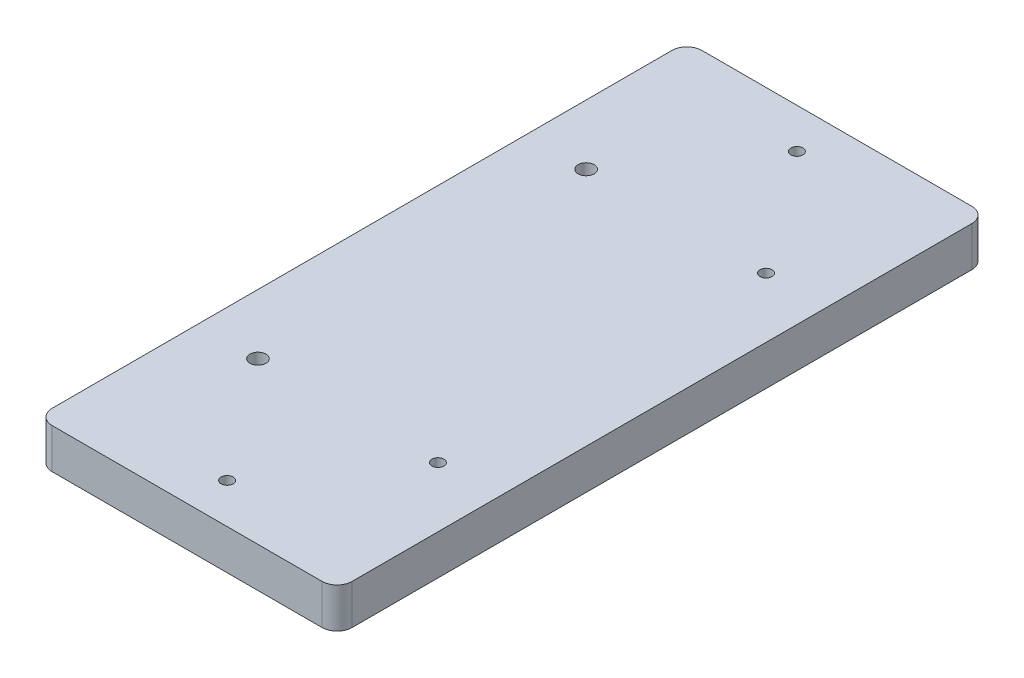
ISO-10303-21;
HEADER;
FILE_DESCRIPTION(('STEP AP214'),'2;1');
FILE_NAME('part.step','',(''),(''),'','','');
FILE_SCHEMA(('AUTOMOTIVE_DESIGN { 1 0 10303 214 1 1 1 1 }'));
ENDSEC;
DATA;
#1=APPLICATION_CONTEXT('core data for automotive mechanical design processes');
#2=APPLICATION_PROTOCOL_DEFINITION('international standard','automotive_design',2000,#1);
#3=PRODUCT_CONTEXT('',#1,'mechanical');
#4=PRODUCT('Part','Part','',(#3));
#5=PRODUCT_RELATED_PRODUCT_CATEGORY('part','',(#4));
#6=PRODUCT_DEFINITION_FORMATION('','',#4);
#7=PRODUCT_DEFINITION_CONTEXT('part definition',#1,'design');
#8=PRODUCT_DEFINITION('design','',#6,#7);
#9=PRODUCT_DEFINITION_SHAPE('','',#8);
#10=(LENGTH_UNIT() NAMED_UNIT(*) SI_UNIT(.MILLI.,.METRE.));
#11=(NAMED_UNIT(*) PLANE_ANGLE_UNIT() SI_UNIT($,.RADIAN.));
#12=(NAMED_UNIT(*) SI_UNIT($,.STERADIAN.) SOLID_ANGLE_UNIT());
#13=UNCERTAINTY_MEASURE_WITH_UNIT(LENGTH_MEASURE(1.E-05),#10,'distance_accuracy_value','');
#14=(GEOMETRIC_REPRESENTATION_CONTEXT(3) GLOBAL_UNCERTAINTY_ASSIGNED_CONTEXT((#13)) GLOBAL_UNIT_ASSIGNED_CONTEXT((#10,
#11,#12)) REPRESENTATION_CONTEXT('',''));
#15=CARTESIAN_POINT('',(0.,0.,0.));
#16=DIRECTION('',(0.,0.,1.));
#17=DIRECTION('',(1.,0.,0.));
#18=AXIS2_PLACEMENT_3D('',#15,#16,#17);
#19=CARTESIAN_POINT('',(0.,8.,0.));
#20=DIRECTION('',(0.,-1.,0.));
#21=DIRECTION('',(0.,0.,-1.));
#22=AXIS2_PLACEMENT_3D('',#19,#20,#21);
#23=PLANE('',#22);
#24=DIRECTION('',(-1.,0.,0.));
#25=VECTOR('',#24,1.);
#26=CARTESIAN_POINT('',(0.,8.,-130.));
#27=LINE('',#26,#25);
#28=CARTESIAN_POINT('',(57.,8.,-130.));
#29=VERTEX_POINT('',#28);
#30=CARTESIAN_POINT('',(3.,8.,-130.));
#31=VERTEX_POINT('',#30);
#32=EDGE_CURVE('E175',#29,#31,#27,.T.);
#33=ORIENTED_EDGE('',*,*,#32,.T.);
#34=CARTESIAN_POINT('',(3.,8.,-127.));
#35=DIRECTION('',(0.,-1.,0.));
#36=DIRECTION('',(0.,0.,-1.));
#37=AXIS2_PLACEMENT_3D('',#34,#35,#36);
#38=CIRCLE('',#37,3.);
#39=CARTESIAN_POINT('',(0.,8.,-127.));
#40=VERTEX_POINT('',#39);
#41=EDGE_CURVE('E152',#31,#40,#38,.F.);
#42=ORIENTED_EDGE('',*,*,#41,.T.);
#43=DIRECTION('',(0.,0.,1.));
#44=VECTOR('',#43,1.);
#45=CARTESIAN_POINT('',(0.,8.,0.));
#46=LINE('',#45,#44);
#47=CARTESIAN_POINT('',(0.,8.,-3.));
#48=VERTEX_POINT('',#47);
#49=EDGE_CURVE('E123',#40,#48,#46,.T.);
#50=ORIENTED_EDGE('',*,*,#49,.T.);
#51=CARTESIAN_POINT('',(3.,8.,-3.));
#52=DIRECTION('',(0.,-1.,0.));
#53=DIRECTION('',(0.,0.,-1.));
#54=AXIS2_PLACEMENT_3D('',#51,#52,#53);
#55=CIRCLE('',#54,3.);
#56=CARTESIAN_POINT('',(3.,8.,0.));
#57=VERTEX_POINT('',#56);
#58=EDGE_CURVE('E147',#48,#57,#55,.F.);
#59=ORIENTED_EDGE('',*,*,#58,.T.);
#60=DIRECTION('',(1.,0.,0.));
#61=VECTOR('',#60,1.);
#62=CARTESIAN_POINT('',(60.,8.,0.));
#63=LINE('',#62,#61);
#64=CARTESIAN_POINT('',(57.,8.,0.));
#65=VERTEX_POINT('',#64);
#66=EDGE_CURVE('E130',#57,#65,#63,.T.);
#67=ORIENTED_EDGE('',*,*,#66,.T.);
#68=CARTESIAN_POINT('',(57.,8.,-3.));
#69=DIRECTION('',(0.,-1.,0.));
#70=DIRECTION('',(0.,0.,-1.));
#71=AXIS2_PLACEMENT_3D('',#68,#69,#70);
#72=CIRCLE('',#71,3.);
#73=CARTESIAN_POINT('',(60.,8.,-3.));
#74=VERTEX_POINT('',#73);
#75=EDGE_CURVE('E59',#65,#74,#72,.F.);
#76=ORIENTED_EDGE('',*,*,#75,.T.);
#77=DIRECTION('',(0.,0.,-1.));
#78=VECTOR('',#77,1.);
#79=CARTESIAN_POINT('',(60.,8.,-130.));
#80=LINE('',#79,#78);
#81=CARTESIAN_POINT('',(60.,8.,-127.));
#82=VERTEX_POINT('',#81);
#83=EDGE_CURVE('E133',#74,#82,#80,.T.);
#84=ORIENTED_EDGE('',*,*,#83,.T.);
#85=CARTESIAN_POINT('',(57.,8.,-127.));
#86=DIRECTION('',(0.,-1.,0.));
#87=DIRECTION('',(0.,0.,-1.));
#88=AXIS2_PLACEMENT_3D('',#85,#86,#87);
#89=CIRCLE('',#88,3.);
#90=EDGE_CURVE('E150',#82,#29,#89,.F.);
#91=ORIENTED_EDGE('',*,*,#90,.T.);
#92=EDGE_LOOP('',(#33,#42,#50,#59,#67,#76,#84,#91));
#93=FACE_BOUND('',#92,.T.);
#94=CARTESIAN_POINT('',(12.,8.,-32.175));
#95=DIRECTION('',(0.,1.,0.));
#96=DIRECTION('',(0.,0.,1.));
#97=AXIS2_PLACEMENT_3D('',#94,#95,#96);
#98=CIRCLE('',#97,1.6);
#99=CARTESIAN_POINT('',(12.,8.,-30.575));
#100=VERTEX_POINT('',#99);
#101=EDGE_CURVE('E168',#100,#100,#98,.T.);
#102=ORIENTED_EDGE('',*,*,#101,.F.);
#103=EDGE_LOOP('',(#102));
#104=FACE_BOUND('',#103,.T.);
#105=CARTESIAN_POINT('',(12.,8.,-97.825));
#106=DIRECTION('',(0.,1.,0.));
#107=DIRECTION('',(0.,0.,1.));
#108=AXIS2_PLACEMENT_3D('',#105,#106,#107);
#109=CIRCLE('',#108,1.6);
#110=CARTESIAN_POINT('',(12.,8.,-96.225));
#111=VERTEX_POINT('',#110);
#112=EDGE_CURVE('E180',#111,#111,#109,.T.);
#113=ORIENTED_EDGE('',*,*,#112,.F.);
#114=EDGE_LOOP('',(#113));
#115=FACE_BOUND('',#114,.T.);
#116=CARTESIAN_POINT('',(30.,8.,-8.));
#117=DIRECTION('',(0.,1.,0.));
#118=DIRECTION('',(0.,0.,1.));
#119=AXIS2_PLACEMENT_3D('',#116,#117,#118);
#120=CIRCLE('',#119,1.2);
#121=CARTESIAN_POINT('',(30.,8.,-6.8));
#122=VERTEX_POINT('',#121);
#123=EDGE_CURVE('E185',#122,#122,#120,.T.);
#124=ORIENTED_EDGE('',*,*,#123,.F.);
#125=EDGE_LOOP('',(#124));
#126=FACE_BOUND('',#125,.T.);
#127=CARTESIAN_POINT('',(30.,8.,-122.));
#128=DIRECTION('',(0.,1.,0.));
#129=DIRECTION('',(0.,0.,1.));
#130=AXIS2_PLACEMENT_3D('',#127,#128,#129);
#131=CIRCLE('',#130,1.2);
#132=CARTESIAN_POINT('',(30.,8.,-120.8));
#133=VERTEX_POINT('',#132);
#134=EDGE_CURVE('E191',#133,#133,#131,.T.);
#135=ORIENTED_EDGE('',*,*,#134,.F.);
#136=EDGE_LOOP('',(#135));
#137=FACE_BOUND('',#136,.T.);
#138=CARTESIAN_POINT('',(48.,8.,-97.825));
#139=DIRECTION('',(0.,1.,0.));
#140=DIRECTION('',(0.,0.,1.));
#141=AXIS2_PLACEMENT_3D('',#138,#139,#140);
#142=CIRCLE('',#141,1.2);
#143=CARTESIAN_POINT('',(48.,8.,-96.625));
#144=VERTEX_POINT('',#143);
#145=EDGE_CURVE('E197',#144,#144,#142,.T.);
#146=ORIENTED_EDGE('',*,*,#145,.F.);
#147=EDGE_LOOP('',(#146));
#148=FACE_BOUND('',#147,.T.);
#149=CARTESIAN_POINT('',(48.,8.,-32.175));
#150=DIRECTION('',(0.,1.,0.));
#151=DIRECTION('',(0.,0.,1.));
#152=AXIS2_PLACEMENT_3D('',#149,#150,#151);
#153=CIRCLE('',#152,1.2);
#154=CARTESIAN_POINT('',(48.,8.,-30.975));
#155=VERTEX_POINT('',#154);
#156=EDGE_CURVE('E203',#155,#155,#153,.T.);
#157=ORIENTED_EDGE('',*,*,#156,.F.);
#158=EDGE_LOOP('',(#157));
#159=FACE_BOUND('',#158,.T.);
#160=ADVANCED_FACE('F37',(#93,#104,#115,#126,#137,#148,#159),#23,.F.);
#161=CARTESIAN_POINT('',(0.,0.,0.));
#162=DIRECTION('',(0.,-1.,0.));
#163=DIRECTION('',(0.,0.,-1.));
#164=AXIS2_PLACEMENT_3D('',#161,#162,#163);
#165=PLANE('',#164);
#166=CARTESIAN_POINT('',(48.,0.,-97.825));
#167=DIRECTION('',(0.,1.,0.));
#168=DIRECTION('',(0.,0.,1.));
#169=AXIS2_PLACEMENT_3D('',#166,#167,#168);
#170=CIRCLE('',#169,1.2);
#171=CARTESIAN_POINT('',(48.,0.,-96.625));
#172=VERTEX_POINT('',#171);
#173=EDGE_CURVE('E200',#172,#172,#170,.T.);
#174=ORIENTED_EDGE('',*,*,#173,.T.);
#175=EDGE_LOOP('',(#174));
#176=FACE_BOUND('',#175,.T.);
#177=CARTESIAN_POINT('',(30.,0.,-8.));
#178=DIRECTION('',(0.,1.,0.));
#179=DIRECTION('',(0.,0.,1.));
#180=AXIS2_PLACEMENT_3D('',#177,#178,#179);
#181=CIRCLE('',#180,1.2);
#182=CARTESIAN_POINT('',(30.,0.,-6.8));
#183=VERTEX_POINT('',#182);
#184=EDGE_CURVE('E188',#183,#183,#181,.T.);
#185=ORIENTED_EDGE('',*,*,#184,.T.);
#186=EDGE_LOOP('',(#185));
#187=FACE_BOUND('',#186,.T.);
#188=CARTESIAN_POINT('',(12.,0.,-32.175));
#189=DIRECTION('',(0.,1.,0.));
#190=DIRECTION('',(0.,0.,1.));
#191=AXIS2_PLACEMENT_3D('',#188,#189,#190);
#192=CIRCLE('',#191,1.6);
#193=CARTESIAN_POINT('',(12.,0.,-30.575));
#194=VERTEX_POINT('',#193);
#195=EDGE_CURVE('E171',#194,#194,#192,.T.);
#196=ORIENTED_EDGE('',*,*,#195,.T.);
#197=EDGE_LOOP('',(#196));
#198=FACE_BOUND('',#197,.T.);
#199=DIRECTION('',(0.,0.,1.));
#200=VECTOR('',#199,1.);
#201=CARTESIAN_POINT('',(0.,0.,0.));
#202=LINE('',#201,#200);
#203=CARTESIAN_POINT('',(0.,0.,-127.));
#204=VERTEX_POINT('',#203);
#205=CARTESIAN_POINT('',(0.,0.,-3.));
#206=VERTEX_POINT('',#205);
#207=EDGE_CURVE('E120',#204,#206,#202,.T.);
#208=ORIENTED_EDGE('',*,*,#207,.F.);
#209=CARTESIAN_POINT('',(3.,0.,-127.));
#210=DIRECTION('',(0.,-1.,0.));
#211=DIRECTION('',(0.,0.,-1.));
#212=AXIS2_PLACEMENT_3D('',#209,#210,#211);
#213=CIRCLE('',#212,3.);
#214=CARTESIAN_POINT('',(3.,0.,-130.));
#215=VERTEX_POINT('',#214);
#216=EDGE_CURVE('E103',#204,#215,#213,.T.);
#217=ORIENTED_EDGE('',*,*,#216,.T.);
#218=DIRECTION('',(-1.,0.,0.));
#219=VECTOR('',#218,1.);
#220=CARTESIAN_POINT('',(0.,0.,-130.));
#221=LINE('',#220,#219);
#222=CARTESIAN_POINT('',(57.,0.,-130.));
#223=VERTEX_POINT('',#222);
#224=EDGE_CURVE('E131',#223,#215,#221,.T.);
#225=ORIENTED_EDGE('',*,*,#224,.F.);
#226=CARTESIAN_POINT('',(57.,0.,-127.));
#227=DIRECTION('',(0.,-1.,0.));
#228=DIRECTION('',(0.,0.,-1.));
#229=AXIS2_PLACEMENT_3D('',#226,#227,#228);
#230=CIRCLE('',#229,3.);
#231=CARTESIAN_POINT('',(60.,0.,-127.));
#232=VERTEX_POINT('',#231);
#233=EDGE_CURVE('E114',#223,#232,#230,.T.);
#234=ORIENTED_EDGE('',*,*,#233,.T.);
#235=DIRECTION('',(0.,0.,-1.));
#236=VECTOR('',#235,1.);
#237=CARTESIAN_POINT('',(60.,0.,-130.));
#238=LINE('',#237,#236);
#239=CARTESIAN_POINT('',(60.,0.,-3.));
#240=VERTEX_POINT('',#239);
#241=EDGE_CURVE('E135',#240,#232,#238,.T.);
#242=ORIENTED_EDGE('',*,*,#241,.F.);
#243=CARTESIAN_POINT('',(57.,0.,-3.));
#244=DIRECTION('',(0.,-1.,0.));
#245=DIRECTION('',(0.,0.,-1.));
#246=AXIS2_PLACEMENT_3D('',#243,#244,#245);
#247=CIRCLE('',#246,3.);
#248=CARTESIAN_POINT('',(57.,0.,0.));
#249=VERTEX_POINT('',#248);
#250=EDGE_CURVE('E141',#240,#249,#247,.T.);
#251=ORIENTED_EDGE('',*,*,#250,.T.);
#252=DIRECTION('',(1.,0.,0.));
#253=VECTOR('',#252,1.);
#254=CARTESIAN_POINT('',(60.,0.,0.));
#255=LINE('',#254,#253);
#256=CARTESIAN_POINT('',(3.,0.,0.));
#257=VERTEX_POINT('',#256);
#258=EDGE_CURVE('E163',#257,#249,#255,.T.);
#259=ORIENTED_EDGE('',*,*,#258,.F.);
#260=CARTESIAN_POINT('',(3.,0.,-3.));
#261=DIRECTION('',(0.,-1.,0.));
#262=DIRECTION('',(0.,0.,-1.));
#263=AXIS2_PLACEMENT_3D('',#260,#261,#262);
#264=CIRCLE('',#263,3.);
#265=EDGE_CURVE('E124',#257,#206,#264,.T.);
#266=ORIENTED_EDGE('',*,*,#265,.T.);
#267=EDGE_LOOP('',(#208,#217,#225,#234,#242,#251,#259,#266));
#268=FACE_BOUND('',#267,.T.);
#269=CARTESIAN_POINT('',(12.,0.,-97.825));
#270=DIRECTION('',(0.,1.,0.));
#271=DIRECTION('',(0.,0.,1.));
#272=AXIS2_PLACEMENT_3D('',#269,#270,#271);
#273=CIRCLE('',#272,1.6);
#274=CARTESIAN_POINT('',(12.,0.,-96.225));
#275=VERTEX_POINT('',#274);
#276=EDGE_CURVE('E182',#275,#275,#273,.T.);
#277=ORIENTED_EDGE('',*,*,#276,.T.);
#278=EDGE_LOOP('',(#277));
#279=FACE_BOUND('',#278,.T.);
#280=CARTESIAN_POINT('',(30.,0.,-122.));
#281=DIRECTION('',(0.,1.,0.));
#282=DIRECTION('',(0.,0.,1.));
#283=AXIS2_PLACEMENT_3D('',#280,#281,#282);
#284=CIRCLE('',#283,1.2);
#285=CARTESIAN_POINT('',(30.,0.,-120.8));
#286=VERTEX_POINT('',#285);
#287=EDGE_CURVE('E194',#286,#286,#284,.T.);
#288=ORIENTED_EDGE('',*,*,#287,.T.);
#289=EDGE_LOOP('',(#288));
#290=FACE_BOUND('',#289,.T.);
#291=CARTESIAN_POINT('',(48.,0.,-32.175));
#292=DIRECTION('',(0.,1.,0.));
#293=DIRECTION('',(0.,0.,1.));
#294=AXIS2_PLACEMENT_3D('',#291,#292,#293);
#295=CIRCLE('',#294,1.2);
#296=CARTESIAN_POINT('',(48.,0.,-30.975));
#297=VERTEX_POINT('',#296);
#298=EDGE_CURVE('E206',#297,#297,#295,.T.);
#299=ORIENTED_EDGE('',*,*,#298,.T.);
#300=EDGE_LOOP('',(#299));
#301=FACE_BOUND('',#300,.T.);
#302=ADVANCED_FACE('F127',(#176,#187,#198,#268,#279,#290,#301),#165,.T.);
#303=CARTESIAN_POINT('',(60.,8.,0.));
#304=DIRECTION('',(0.,0.,-1.));
#305=DIRECTION('',(-1.,0.,0.));
#306=AXIS2_PLACEMENT_3D('',#303,#304,#305);
#307=PLANE('',#306);
#308=ORIENTED_EDGE('',*,*,#258,.T.);
#309=DIRECTION('',(0.,-1.,0.));
#310=VECTOR('',#309,1.);
#311=CARTESIAN_POINT('',(57.,8.,0.));
#312=LINE('',#311,#310);
#313=EDGE_CURVE('E11',#249,#65,#312,.F.);
#314=ORIENTED_EDGE('',*,*,#313,.T.);
#315=ORIENTED_EDGE('',*,*,#66,.F.);
#316=DIRECTION('',(0.,-1.,0.));
#317=VECTOR('',#316,1.);
#318=CARTESIAN_POINT('',(3.,8.,0.));
#319=LINE('',#318,#317);
#320=EDGE_CURVE('E45',#57,#257,#319,.T.);
#321=ORIENTED_EDGE('',*,*,#320,.T.);
#322=EDGE_LOOP('',(#308,#314,#315,#321));
#323=FACE_BOUND('',#322,.T.);
#324=ADVANCED_FACE('F162',(#323),#307,.F.);
#325=CARTESIAN_POINT('',(60.,8.,-130.));
#326=DIRECTION('',(-1.,0.,0.));
#327=DIRECTION('',(0.,0.,1.));
#328=AXIS2_PLACEMENT_3D('',#325,#326,#327);
#329=PLANE('',#328);
#330=ORIENTED_EDGE('',*,*,#241,.T.);
#331=DIRECTION('',(0.,-1.,0.));
#332=VECTOR('',#331,1.);
#333=CARTESIAN_POINT('',(60.,8.,-127.));
#334=LINE('',#333,#332);
#335=EDGE_CURVE('E52',#232,#82,#334,.F.);
#336=ORIENTED_EDGE('',*,*,#335,.T.);
#337=ORIENTED_EDGE('',*,*,#83,.F.);
#338=DIRECTION('',(0.,-1.,0.));
#339=VECTOR('',#338,1.);
#340=CARTESIAN_POINT('',(60.,8.,-3.));
#341=LINE('',#340,#339);
#342=EDGE_CURVE('E154',#74,#240,#341,.T.);
#343=ORIENTED_EDGE('',*,*,#342,.T.);
#344=EDGE_LOOP('',(#330,#336,#337,#343));
#345=FACE_BOUND('',#344,.T.);
#346=ADVANCED_FACE('F232',(#345),#329,.F.);
#347=CARTESIAN_POINT('',(0.,8.,-130.));
#348=DIRECTION('',(0.,0.,1.));
#349=DIRECTION('',(1.,0.,0.));
#350=AXIS2_PLACEMENT_3D('',#347,#348,#349);
#351=PLANE('',#350);
#352=ORIENTED_EDGE('',*,*,#224,.T.);
#353=DIRECTION('',(0.,-1.,0.));
#354=VECTOR('',#353,1.);
#355=CARTESIAN_POINT('',(3.,8.,-130.));
#356=LINE('',#355,#354);
#357=EDGE_CURVE('E108',#215,#31,#356,.F.);
#358=ORIENTED_EDGE('',*,*,#357,.T.);
#359=ORIENTED_EDGE('',*,*,#32,.F.);
#360=DIRECTION('',(0.,-1.,0.));
#361=VECTOR('',#360,1.);
#362=CARTESIAN_POINT('',(57.,8.,-130.));
#363=LINE('',#362,#361);
#364=EDGE_CURVE('E113',#29,#223,#363,.T.);
#365=ORIENTED_EDGE('',*,*,#364,.T.);
#366=EDGE_LOOP('',(#352,#358,#359,#365));
#367=FACE_BOUND('',#366,.T.);
#368=ADVANCED_FACE('F229',(#367),#351,.F.);
#369=CARTESIAN_POINT('',(0.,8.,0.));
#370=DIRECTION('',(1.,0.,0.));
#371=DIRECTION('',(0.,0.,-1.));
#372=AXIS2_PLACEMENT_3D('',#369,#370,#371);
#373=PLANE('',#372);
#374=ORIENTED_EDGE('',*,*,#49,.F.);
#375=DIRECTION('',(0.,-1.,0.));
#376=VECTOR('',#375,1.);
#377=CARTESIAN_POINT('',(0.,8.,-127.));
#378=LINE('',#377,#376);
#379=EDGE_CURVE('E107',#40,#204,#378,.T.);
#380=ORIENTED_EDGE('',*,*,#379,.T.);
#381=ORIENTED_EDGE('',*,*,#207,.T.);
#382=DIRECTION('',(0.,-1.,0.));
#383=VECTOR('',#382,1.);
#384=CARTESIAN_POINT('',(0.,8.,-3.));
#385=LINE('',#384,#383);
#386=EDGE_CURVE('E125',#206,#48,#385,.F.);
#387=ORIENTED_EDGE('',*,*,#386,.T.);
#388=EDGE_LOOP('',(#374,#380,#381,#387));
#389=FACE_BOUND('',#388,.T.);
#390=ADVANCED_FACE('F119',(#389),#373,.F.);
#391=CARTESIAN_POINT('',(12.,8.,-32.175));
#392=DIRECTION('',(0.,-1.,0.));
#393=DIRECTION('',(0.,0.,-1.));
#394=AXIS2_PLACEMENT_3D('',#391,#392,#393);
#395=CYLINDRICAL_SURFACE('',#394,1.6);
#396=ORIENTED_EDGE('',*,*,#101,.T.);
#397=EDGE_LOOP('',(#396));
#398=FACE_BOUND('',#397,.T.);
#399=ORIENTED_EDGE('',*,*,#195,.F.);
#400=EDGE_LOOP('',(#399));
#401=FACE_BOUND('',#400,.T.);
#402=ADVANCED_FACE('F224',(#398,#401),#395,.F.);
#403=CARTESIAN_POINT('',(12.,8.,-97.825));
#404=DIRECTION('',(0.,-1.,0.));
#405=DIRECTION('',(0.,0.,-1.));
#406=AXIS2_PLACEMENT_3D('',#403,#404,#405);
#407=CYLINDRICAL_SURFACE('',#406,1.6);
#408=ORIENTED_EDGE('',*,*,#112,.T.);
#409=EDGE_LOOP('',(#408));
#410=FACE_BOUND('',#409,.T.);
#411=ORIENTED_EDGE('',*,*,#276,.F.);
#412=EDGE_LOOP('',(#411));
#413=FACE_BOUND('',#412,.T.);
#414=ADVANCED_FACE('F345',(#410,#413),#407,.F.);
#415=CARTESIAN_POINT('',(30.,8.,-8.));
#416=DIRECTION('',(0.,-1.,0.));
#417=DIRECTION('',(0.,0.,-1.));
#418=AXIS2_PLACEMENT_3D('',#415,#416,#417);
#419=CYLINDRICAL_SURFACE('',#418,1.2);
#420=ORIENTED_EDGE('',*,*,#123,.T.);
#421=EDGE_LOOP('',(#420));
#422=FACE_BOUND('',#421,.T.);
#423=ORIENTED_EDGE('',*,*,#184,.F.);
#424=EDGE_LOOP('',(#423));
#425=FACE_BOUND('',#424,.T.);
#426=ADVANCED_FACE('F335',(#422,#425),#419,.F.);
#427=CARTESIAN_POINT('',(30.,8.,-122.));
#428=DIRECTION('',(0.,-1.,0.));
#429=DIRECTION('',(0.,0.,-1.));
#430=AXIS2_PLACEMENT_3D('',#427,#428,#429);
#431=CYLINDRICAL_SURFACE('',#430,1.2);
#432=ORIENTED_EDGE('',*,*,#134,.T.);
#433=EDGE_LOOP('',(#432));
#434=FACE_BOUND('',#433,.T.);
#435=ORIENTED_EDGE('',*,*,#287,.F.);
#436=EDGE_LOOP('',(#435));
#437=FACE_BOUND('',#436,.T.);
#438=ADVANCED_FACE('F325',(#434,#437),#431,.F.);
#439=CARTESIAN_POINT('',(48.,8.,-97.825));
#440=DIRECTION('',(0.,-1.,0.));
#441=DIRECTION('',(0.,0.,-1.));
#442=AXIS2_PLACEMENT_3D('',#439,#440,#441);
#443=CYLINDRICAL_SURFACE('',#442,1.2);
#444=ORIENTED_EDGE('',*,*,#145,.T.);
#445=EDGE_LOOP('',(#444));
#446=FACE_BOUND('',#445,.T.);
#447=ORIENTED_EDGE('',*,*,#173,.F.);
#448=EDGE_LOOP('',(#447));
#449=FACE_BOUND('',#448,.T.);
#450=ADVANCED_FACE('F316',(#446,#449),#443,.F.);
#451=CARTESIAN_POINT('',(48.,8.,-32.175));
#452=DIRECTION('',(0.,-1.,0.));
#453=DIRECTION('',(0.,0.,-1.));
#454=AXIS2_PLACEMENT_3D('',#451,#452,#453);
#455=CYLINDRICAL_SURFACE('',#454,1.2);
#456=ORIENTED_EDGE('',*,*,#156,.T.);
#457=EDGE_LOOP('',(#456));
#458=FACE_BOUND('',#457,.T.);
#459=ORIENTED_EDGE('',*,*,#298,.F.);
#460=EDGE_LOOP('',(#459));
#461=FACE_BOUND('',#460,.T.);
#462=ADVANCED_FACE('F212',(#458,#461),#455,.F.);
#463=CARTESIAN_POINT('',(3.,8.,-127.));
#464=DIRECTION('',(0.,-1.,0.));
#465=DIRECTION('',(0.,0.,-1.));
#466=AXIS2_PLACEMENT_3D('',#463,#464,#465);
#467=CYLINDRICAL_SURFACE('',#466,3.);
#468=ORIENTED_EDGE('',*,*,#41,.F.);
#469=ORIENTED_EDGE('',*,*,#357,.F.);
#470=ORIENTED_EDGE('',*,*,#216,.F.);
#471=ORIENTED_EDGE('',*,*,#379,.F.);
#472=EDGE_LOOP('',(#468,#469,#470,#471));
#473=FACE_BOUND('',#472,.T.);
#474=ADVANCED_FACE('F106',(#473),#467,.T.);
#475=CARTESIAN_POINT('',(57.,8.,-127.));
#476=DIRECTION('',(0.,-1.,0.));
#477=DIRECTION('',(0.,0.,-1.));
#478=AXIS2_PLACEMENT_3D('',#475,#476,#477);
#479=CYLINDRICAL_SURFACE('',#478,3.);
#480=ORIENTED_EDGE('',*,*,#90,.F.);
#481=ORIENTED_EDGE('',*,*,#335,.F.);
#482=ORIENTED_EDGE('',*,*,#233,.F.);
#483=ORIENTED_EDGE('',*,*,#364,.F.);
#484=EDGE_LOOP('',(#480,#481,#482,#483));
#485=FACE_BOUND('',#484,.T.);
#486=ADVANCED_FACE('F240',(#485),#479,.T.);
#487=CARTESIAN_POINT('',(57.,8.,-3.));
#488=DIRECTION('',(0.,-1.,0.));
#489=DIRECTION('',(0.,0.,-1.));
#490=AXIS2_PLACEMENT_3D('',#487,#488,#489);
#491=CYLINDRICAL_SURFACE('',#490,3.);
#492=ORIENTED_EDGE('',*,*,#75,.F.);
#493=ORIENTED_EDGE('',*,*,#313,.F.);
#494=ORIENTED_EDGE('',*,*,#250,.F.);
#495=ORIENTED_EDGE('',*,*,#342,.F.);
#496=EDGE_LOOP('',(#492,#493,#494,#495));
#497=FACE_BOUND('',#496,.T.);
#498=ADVANCED_FACE('F242',(#497),#491,.T.);
#499=CARTESIAN_POINT('',(3.,8.,-3.));
#500=DIRECTION('',(0.,-1.,0.));
#501=DIRECTION('',(0.,0.,-1.));
#502=AXIS2_PLACEMENT_3D('',#499,#500,#501);
#503=CYLINDRICAL_SURFACE('',#502,3.);
#504=ORIENTED_EDGE('',*,*,#58,.F.);
#505=ORIENTED_EDGE('',*,*,#386,.F.);
#506=ORIENTED_EDGE('',*,*,#265,.F.);
#507=ORIENTED_EDGE('',*,*,#320,.F.);
#508=EDGE_LOOP('',(#504,#505,#506,#507));
#509=FACE_BOUND('',#508,.T.);
#510=ADVANCED_FACE('F39',(#509),#503,.T.);
#511=CLOSED_SHELL('',(#160,#302,#324,#346,#368,#390,#402,#414,#426,#438,#450,#462,#474,#486,
#498,#510));
#512=MANIFOLD_SOLID_BREP('B2',#511);
#513=ADVANCED_BREP_SHAPE_REPRESENTATION('',(#18,#512),#14);
#514=SHAPE_DEFINITION_REPRESENTATION(#9,#513);
ENDSEC;
END-ISO-10303-21;
